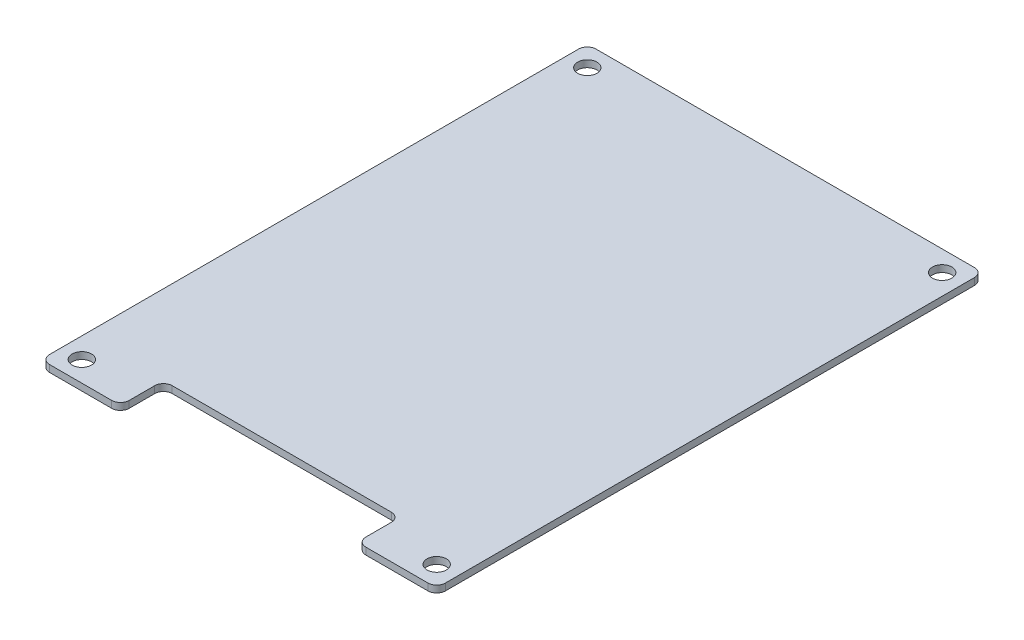
ISO-10303-21;
HEADER;
FILE_DESCRIPTION(('STEP AP214'),'2;1');
FILE_NAME('part.step','',(''),(''),'','','');
FILE_SCHEMA(('AUTOMOTIVE_DESIGN { 1 0 10303 214 1 1 1 1 }'));
ENDSEC;
DATA;
#1=APPLICATION_CONTEXT('core data for automotive mechanical design processes');
#2=APPLICATION_PROTOCOL_DEFINITION('international standard','automotive_design',2000,#1);
#3=PRODUCT_CONTEXT('',#1,'mechanical');
#4=PRODUCT('Part','Part','',(#3));
#5=PRODUCT_RELATED_PRODUCT_CATEGORY('part','',(#4));
#6=PRODUCT_DEFINITION_FORMATION('','',#4);
#7=PRODUCT_DEFINITION_CONTEXT('part definition',#1,'design');
#8=PRODUCT_DEFINITION('design','',#6,#7);
#9=PRODUCT_DEFINITION_SHAPE('','',#8);
#10=(LENGTH_UNIT() NAMED_UNIT(*) SI_UNIT(.MILLI.,.METRE.));
#11=(NAMED_UNIT(*) PLANE_ANGLE_UNIT() SI_UNIT($,.RADIAN.));
#12=(NAMED_UNIT(*) SI_UNIT($,.STERADIAN.) SOLID_ANGLE_UNIT());
#13=UNCERTAINTY_MEASURE_WITH_UNIT(LENGTH_MEASURE(1.E-05),#10,'distance_accuracy_value','');
#14=(GEOMETRIC_REPRESENTATION_CONTEXT(3) GLOBAL_UNCERTAINTY_ASSIGNED_CONTEXT((#13)) GLOBAL_UNIT_ASSIGNED_CONTEXT((#10,
#11,#12)) REPRESENTATION_CONTEXT('',''));
#15=CARTESIAN_POINT('',(0.,0.,0.));
#16=DIRECTION('',(0.,0.,1.));
#17=DIRECTION('',(1.,0.,0.));
#18=AXIS2_PLACEMENT_3D('',#15,#16,#17);
#19=CARTESIAN_POINT('',(-46.,1.6,63.5));
#20=DIRECTION('',(0.,0.,-1.));
#21=DIRECTION('',(-1.,0.,0.));
#22=AXIS2_PLACEMENT_3D('',#19,#20,#21);
#23=PLANE('',#22);
#24=DIRECTION('',(1.,0.,0.));
#25=VECTOR('',#24,1.);
#26=CARTESIAN_POINT('',(-46.,0.,63.5));
#27=LINE('',#26,#25);
#28=CARTESIAN_POINT('',(29.532,0.,63.5));
#29=VERTEX_POINT('',#28);
#30=CARTESIAN_POINT('',(43.968,0.,63.5));
#31=VERTEX_POINT('',#30);
#32=EDGE_CURVE('E180',#29,#31,#27,.T.);
#33=ORIENTED_EDGE('',*,*,#32,.T.);
#34=DIRECTION('',(0.,-1.,0.));
#35=VECTOR('',#34,1.);
#36=CARTESIAN_POINT('',(43.968,1.6,63.5));
#37=LINE('',#36,#35);
#38=CARTESIAN_POINT('',(43.968,1.6,63.5));
#39=VERTEX_POINT('',#38);
#40=EDGE_CURVE('E229',#31,#39,#37,.F.);
#41=ORIENTED_EDGE('',*,*,#40,.T.);
#42=DIRECTION('',(1.,0.,0.));
#43=VECTOR('',#42,1.);
#44=CARTESIAN_POINT('',(-46.,1.6,63.5));
#45=LINE('',#44,#43);
#46=CARTESIAN_POINT('',(29.532,1.6,63.5));
#47=VERTEX_POINT('',#46);
#48=EDGE_CURVE('E305',#47,#39,#45,.T.);
#49=ORIENTED_EDGE('',*,*,#48,.F.);
#50=DIRECTION('',(0.,1.,0.));
#51=VECTOR('',#50,1.);
#52=CARTESIAN_POINT('',(29.532,1.6,63.5));
#53=LINE('',#52,#51);
#54=EDGE_CURVE('E227',#47,#29,#53,.F.);
#55=ORIENTED_EDGE('',*,*,#54,.T.);
#56=EDGE_LOOP('',(#33,#41,#49,#55));
#57=FACE_BOUND('',#56,.T.);
#58=ADVANCED_FACE('F39',(#57),#23,.F.);
#59=CARTESIAN_POINT('',(46.,1.6,63.5));
#60=DIRECTION('',(-1.,0.,0.));
#61=DIRECTION('',(0.,0.,1.));
#62=AXIS2_PLACEMENT_3D('',#59,#60,#61);
#63=PLANE('',#62);
#64=DIRECTION('',(0.,0.,-1.));
#65=VECTOR('',#64,1.);
#66=CARTESIAN_POINT('',(46.,0.,63.5));
#67=LINE('',#66,#65);
#68=CARTESIAN_POINT('',(46.,0.,61.468));
#69=VERTEX_POINT('',#68);
#70=CARTESIAN_POINT('',(46.,0.,-61.468));
#71=VERTEX_POINT('',#70);
#72=EDGE_CURVE('E186',#69,#71,#67,.T.);
#73=ORIENTED_EDGE('',*,*,#72,.T.);
#74=DIRECTION('',(0.,-1.,0.));
#75=VECTOR('',#74,1.);
#76=CARTESIAN_POINT('',(46.,1.6,-61.468));
#77=LINE('',#76,#75);
#78=CARTESIAN_POINT('',(46.,1.6,-61.468));
#79=VERTEX_POINT('',#78);
#80=EDGE_CURVE('E225',#71,#79,#77,.F.);
#81=ORIENTED_EDGE('',*,*,#80,.T.);
#82=DIRECTION('',(0.,0.,-1.));
#83=VECTOR('',#82,1.);
#84=CARTESIAN_POINT('',(46.,1.6,63.5));
#85=LINE('',#84,#83);
#86=CARTESIAN_POINT('',(46.,1.6,61.468));
#87=VERTEX_POINT('',#86);
#88=EDGE_CURVE('E299',#87,#79,#85,.T.);
#89=ORIENTED_EDGE('',*,*,#88,.F.);
#90=DIRECTION('',(0.,-1.,0.));
#91=VECTOR('',#90,1.);
#92=CARTESIAN_POINT('',(46.,1.6,61.468));
#93=LINE('',#92,#91);
#94=EDGE_CURVE('E222',#87,#69,#93,.T.);
#95=ORIENTED_EDGE('',*,*,#94,.T.);
#96=EDGE_LOOP('',(#73,#81,#89,#95));
#97=FACE_BOUND('',#96,.T.);
#98=ADVANCED_FACE('F310',(#97),#63,.F.);
#99=CARTESIAN_POINT('',(-46.,1.6,-63.5));
#100=DIRECTION('',(0.,0.,1.));
#101=DIRECTION('',(1.,0.,0.));
#102=AXIS2_PLACEMENT_3D('',#99,#100,#101);
#103=PLANE('',#102);
#104=DIRECTION('',(-1.,0.,0.));
#105=VECTOR('',#104,1.);
#106=CARTESIAN_POINT('',(-46.,0.,-63.5));
#107=LINE('',#106,#105);
#108=CARTESIAN_POINT('',(43.968,0.,-63.5));
#109=VERTEX_POINT('',#108);
#110=CARTESIAN_POINT('',(-43.968,0.,-63.5));
#111=VERTEX_POINT('',#110);
#112=EDGE_CURVE('E181',#109,#111,#107,.T.);
#113=ORIENTED_EDGE('',*,*,#112,.T.);
#114=DIRECTION('',(0.,-1.,0.));
#115=VECTOR('',#114,1.);
#116=CARTESIAN_POINT('',(-43.968,1.6,-63.5));
#117=LINE('',#116,#115);
#118=CARTESIAN_POINT('',(-43.968,1.6,-63.5));
#119=VERTEX_POINT('',#118);
#120=EDGE_CURVE('E157',#111,#119,#117,.F.);
#121=ORIENTED_EDGE('',*,*,#120,.T.);
#122=DIRECTION('',(-1.,0.,0.));
#123=VECTOR('',#122,1.);
#124=CARTESIAN_POINT('',(-46.,1.6,-63.5));
#125=LINE('',#124,#123);
#126=CARTESIAN_POINT('',(43.968,1.6,-63.5));
#127=VERTEX_POINT('',#126);
#128=EDGE_CURVE('E302',#127,#119,#125,.T.);
#129=ORIENTED_EDGE('',*,*,#128,.F.);
#130=DIRECTION('',(0.,-1.,0.));
#131=VECTOR('',#130,1.);
#132=CARTESIAN_POINT('',(43.968,1.6,-63.5));
#133=LINE('',#132,#131);
#134=EDGE_CURVE('E162',#127,#109,#133,.T.);
#135=ORIENTED_EDGE('',*,*,#134,.T.);
#136=EDGE_LOOP('',(#113,#121,#129,#135));
#137=FACE_BOUND('',#136,.T.);
#138=ADVANCED_FACE('F319',(#137),#103,.F.);
#139=CARTESIAN_POINT('',(-46.,1.6,63.5));
#140=DIRECTION('',(1.,0.,0.));
#141=DIRECTION('',(0.,0.,-1.));
#142=AXIS2_PLACEMENT_3D('',#139,#140,#141);
#143=PLANE('',#142);
#144=DIRECTION('',(0.,0.,1.));
#145=VECTOR('',#144,1.);
#146=CARTESIAN_POINT('',(-46.,1.6,63.5));
#147=LINE('',#146,#145);
#148=CARTESIAN_POINT('',(-46.,1.6,-61.468));
#149=VERTEX_POINT('',#148);
#150=CARTESIAN_POINT('',(-46.,1.6,61.468));
#151=VERTEX_POINT('',#150);
#152=EDGE_CURVE('E172',#149,#151,#147,.T.);
#153=ORIENTED_EDGE('',*,*,#152,.F.);
#154=DIRECTION('',(0.,-1.,0.));
#155=VECTOR('',#154,1.);
#156=CARTESIAN_POINT('',(-46.,1.6,-61.468));
#157=LINE('',#156,#155);
#158=CARTESIAN_POINT('',(-46.,0.,-61.468));
#159=VERTEX_POINT('',#158);
#160=EDGE_CURVE('E156',#149,#159,#157,.T.);
#161=ORIENTED_EDGE('',*,*,#160,.T.);
#162=DIRECTION('',(0.,0.,1.));
#163=VECTOR('',#162,1.);
#164=CARTESIAN_POINT('',(-46.,0.,63.5));
#165=LINE('',#164,#163);
#166=CARTESIAN_POINT('',(-46.,0.,61.468));
#167=VERTEX_POINT('',#166);
#168=EDGE_CURVE('E169',#159,#167,#165,.T.);
#169=ORIENTED_EDGE('',*,*,#168,.T.);
#170=DIRECTION('',(0.,-1.,0.));
#171=VECTOR('',#170,1.);
#172=CARTESIAN_POINT('',(-46.,1.6,61.468));
#173=LINE('',#172,#171);
#174=EDGE_CURVE('E174',#167,#151,#173,.F.);
#175=ORIENTED_EDGE('',*,*,#174,.T.);
#176=EDGE_LOOP('',(#153,#161,#169,#175));
#177=FACE_BOUND('',#176,.T.);
#178=ADVANCED_FACE('F168',(#177),#143,.F.);
#179=CARTESIAN_POINT('',(-43.968,1.6,63.5));
#180=VERTEX_POINT('',#179);
#181=CARTESIAN_POINT('',(-29.532,1.6,63.5));
#182=VERTEX_POINT('',#181);
#183=EDGE_CURVE('E199',#180,#182,#45,.T.);
#184=ORIENTED_EDGE('',*,*,#183,.F.);
#185=DIRECTION('',(0.,-1.,0.));
#186=VECTOR('',#185,1.);
#187=CARTESIAN_POINT('',(-43.968,1.6,63.5));
#188=LINE('',#187,#186);
#189=CARTESIAN_POINT('',(-43.968,0.,63.5));
#190=VERTEX_POINT('',#189);
#191=EDGE_CURVE('E244',#180,#190,#188,.T.);
#192=ORIENTED_EDGE('',*,*,#191,.T.);
#193=CARTESIAN_POINT('',(-29.532,0.,63.5));
#194=VERTEX_POINT('',#193);
#195=EDGE_CURVE('E184',#190,#194,#27,.T.);
#196=ORIENTED_EDGE('',*,*,#195,.T.);
#197=DIRECTION('',(0.,1.,0.));
#198=VECTOR('',#197,1.);
#199=CARTESIAN_POINT('',(-29.532,1.6,63.5));
#200=LINE('',#199,#198);
#201=EDGE_CURVE('E241',#194,#182,#200,.T.);
#202=ORIENTED_EDGE('',*,*,#201,.T.);
#203=EDGE_LOOP('',(#184,#192,#196,#202));
#204=FACE_BOUND('',#203,.T.);
#205=ADVANCED_FACE('F326',(#204),#23,.F.);
#206=CARTESIAN_POINT('',(0.,1.6,0.));
#207=DIRECTION('',(0.,-1.,0.));
#208=DIRECTION('',(0.,0.,-1.));
#209=AXIS2_PLACEMENT_3D('',#206,#207,#208);
#210=PLANE('',#209);
#211=CARTESIAN_POINT('',(-41.2375,1.6,-58.7375));
#212=DIRECTION('',(0.,1.,0.));
#213=DIRECTION('',(0.,0.,1.));
#214=AXIS2_PLACEMENT_3D('',#211,#212,#213);
#215=CIRCLE('',#214,2.25);
#216=CARTESIAN_POINT('',(-41.2375,1.6,-56.4875));
#217=VERTEX_POINT('',#216);
#218=EDGE_CURVE('E276',#217,#217,#215,.T.);
#219=ORIENTED_EDGE('',*,*,#218,.F.);
#220=EDGE_LOOP('',(#219));
#221=FACE_BOUND('',#220,.T.);
#222=CARTESIAN_POINT('',(41.2375,1.6,-58.7375));
#223=DIRECTION('',(0.,1.,0.));
#224=DIRECTION('',(0.,0.,1.));
#225=AXIS2_PLACEMENT_3D('',#222,#223,#224);
#226=CIRCLE('',#225,2.25);
#227=CARTESIAN_POINT('',(41.2375,1.6,-56.4875));
#228=VERTEX_POINT('',#227);
#229=EDGE_CURVE('E198',#228,#228,#226,.T.);
#230=ORIENTED_EDGE('',*,*,#229,.F.);
#231=EDGE_LOOP('',(#230));
#232=FACE_BOUND('',#231,.T.);
#233=CARTESIAN_POINT('',(41.2375,1.6,58.7375));
#234=DIRECTION('',(0.,1.,0.));
#235=DIRECTION('',(0.,0.,1.));
#236=AXIS2_PLACEMENT_3D('',#233,#234,#235);
#237=CIRCLE('',#236,2.25);
#238=CARTESIAN_POINT('',(41.2375,1.6,60.9875));
#239=VERTEX_POINT('',#238);
#240=EDGE_CURVE('E194',#239,#239,#237,.T.);
#241=ORIENTED_EDGE('',*,*,#240,.F.);
#242=EDGE_LOOP('',(#241));
#243=FACE_BOUND('',#242,.T.);
#244=CARTESIAN_POINT('',(-41.2375,1.6,58.7375));
#245=DIRECTION('',(0.,1.,0.));
#246=DIRECTION('',(0.,0.,1.));
#247=AXIS2_PLACEMENT_3D('',#244,#245,#246);
#248=CIRCLE('',#247,2.25);
#249=CARTESIAN_POINT('',(-41.2375,1.6,60.9875));
#250=VERTEX_POINT('',#249);
#251=EDGE_CURVE('E193',#250,#250,#248,.T.);
#252=ORIENTED_EDGE('',*,*,#251,.F.);
#253=EDGE_LOOP('',(#252));
#254=FACE_BOUND('',#253,.T.);
#255=ORIENTED_EDGE('',*,*,#128,.T.);
#256=CARTESIAN_POINT('',(-43.968,1.6,-61.468));
#257=DIRECTION('',(0.,-1.,0.));
#258=DIRECTION('',(0.,0.,-1.));
#259=AXIS2_PLACEMENT_3D('',#256,#257,#258);
#260=CIRCLE('',#259,2.032);
#261=EDGE_CURVE('E220',#119,#149,#260,.F.);
#262=ORIENTED_EDGE('',*,*,#261,.T.);
#263=ORIENTED_EDGE('',*,*,#152,.T.);
#264=CARTESIAN_POINT('',(-43.968,1.6,61.468));
#265=DIRECTION('',(0.,-1.,0.));
#266=DIRECTION('',(0.,0.,-1.));
#267=AXIS2_PLACEMENT_3D('',#264,#265,#266);
#268=CIRCLE('',#267,2.032);
#269=EDGE_CURVE('E212',#151,#180,#268,.F.);
#270=ORIENTED_EDGE('',*,*,#269,.T.);
#271=ORIENTED_EDGE('',*,*,#183,.T.);
#272=CARTESIAN_POINT('',(-29.532,1.6,61.468));
#273=DIRECTION('',(0.,-1.,0.));
#274=DIRECTION('',(0.,0.,-1.));
#275=AXIS2_PLACEMENT_3D('',#272,#273,#274);
#276=CIRCLE('',#275,2.032);
#277=CARTESIAN_POINT('',(-27.5,1.6,61.468));
#278=VERTEX_POINT('',#277);
#279=EDGE_CURVE('E54',#182,#278,#276,.F.);
#280=ORIENTED_EDGE('',*,*,#279,.T.);
#281=DIRECTION('',(0.,0.,1.));
#282=VECTOR('',#281,1.);
#283=CARTESIAN_POINT('',(-27.5,1.6,53.5));
#284=LINE('',#283,#282);
#285=CARTESIAN_POINT('',(-27.5,1.6,55.532));
#286=VERTEX_POINT('',#285);
#287=EDGE_CURVE('E259',#286,#278,#284,.T.);
#288=ORIENTED_EDGE('',*,*,#287,.F.);
#289=CARTESIAN_POINT('',(-25.468,1.6,55.532));
#290=DIRECTION('',(0.,-1.,0.));
#291=DIRECTION('',(0.,0.,-1.));
#292=AXIS2_PLACEMENT_3D('',#289,#290,#291);
#293=CIRCLE('',#292,2.032);
#294=CARTESIAN_POINT('',(-25.468,1.6,53.5));
#295=VERTEX_POINT('',#294);
#296=EDGE_CURVE('E47',#286,#295,#293,.T.);
#297=ORIENTED_EDGE('',*,*,#296,.T.);
#298=DIRECTION('',(-1.,0.,0.));
#299=VECTOR('',#298,1.);
#300=CARTESIAN_POINT('',(-27.5,1.6,53.5));
#301=LINE('',#300,#299);
#302=CARTESIAN_POINT('',(25.468,1.6,53.5));
#303=VERTEX_POINT('',#302);
#304=EDGE_CURVE('E258',#303,#295,#301,.T.);
#305=ORIENTED_EDGE('',*,*,#304,.F.);
#306=CARTESIAN_POINT('',(25.468,1.6,55.532));
#307=DIRECTION('',(0.,-1.,0.));
#308=DIRECTION('',(0.,0.,-1.));
#309=AXIS2_PLACEMENT_3D('',#306,#307,#308);
#310=CIRCLE('',#309,2.032);
#311=CARTESIAN_POINT('',(27.5,1.6,55.532));
#312=VERTEX_POINT('',#311);
#313=EDGE_CURVE('E251',#303,#312,#310,.T.);
#314=ORIENTED_EDGE('',*,*,#313,.T.);
#315=DIRECTION('',(0.,0.,-1.));
#316=VECTOR('',#315,1.);
#317=CARTESIAN_POINT('',(27.5,1.6,53.5));
#318=LINE('',#317,#316);
#319=CARTESIAN_POINT('',(27.5,1.6,61.468));
#320=VERTEX_POINT('',#319);
#321=EDGE_CURVE('E265',#320,#312,#318,.T.);
#322=ORIENTED_EDGE('',*,*,#321,.F.);
#323=CARTESIAN_POINT('',(29.532,1.6,61.468));
#324=DIRECTION('',(0.,-1.,0.));
#325=DIRECTION('',(0.,0.,-1.));
#326=AXIS2_PLACEMENT_3D('',#323,#324,#325);
#327=CIRCLE('',#326,2.032);
#328=EDGE_CURVE('E214',#320,#47,#327,.F.);
#329=ORIENTED_EDGE('',*,*,#328,.T.);
#330=ORIENTED_EDGE('',*,*,#48,.T.);
#331=CARTESIAN_POINT('',(43.968,1.6,61.468));
#332=DIRECTION('',(0.,-1.,0.));
#333=DIRECTION('',(0.,0.,-1.));
#334=AXIS2_PLACEMENT_3D('',#331,#332,#333);
#335=CIRCLE('',#334,2.032);
#336=EDGE_CURVE('E216',#39,#87,#335,.F.);
#337=ORIENTED_EDGE('',*,*,#336,.T.);
#338=ORIENTED_EDGE('',*,*,#88,.T.);
#339=CARTESIAN_POINT('',(43.968,1.6,-61.468));
#340=DIRECTION('',(0.,-1.,0.));
#341=DIRECTION('',(0.,0.,-1.));
#342=AXIS2_PLACEMENT_3D('',#339,#340,#341);
#343=CIRCLE('',#342,2.032);
#344=EDGE_CURVE('E218',#79,#127,#343,.F.);
#345=ORIENTED_EDGE('',*,*,#344,.T.);
#346=EDGE_LOOP('',(#255,#262,#263,#270,#271,#280,#288,#297,#305,#314,#322,#329,#330,#337,#338,#345));
#347=FACE_BOUND('',#346,.T.);
#348=ADVANCED_FACE('F257',(#221,#232,#243,#254,#347),#210,.F.);
#349=CARTESIAN_POINT('',(0.,0.,0.));
#350=DIRECTION('',(0.,-1.,0.));
#351=DIRECTION('',(0.,0.,-1.));
#352=AXIS2_PLACEMENT_3D('',#349,#350,#351);
#353=PLANE('',#352);
#354=ORIENTED_EDGE('',*,*,#168,.F.);
#355=CARTESIAN_POINT('',(-43.968,0.,-61.468));
#356=DIRECTION('',(0.,-1.,0.));
#357=DIRECTION('',(0.,0.,-1.));
#358=AXIS2_PLACEMENT_3D('',#355,#356,#357);
#359=CIRCLE('',#358,2.032);
#360=EDGE_CURVE('E152',#159,#111,#359,.T.);
#361=ORIENTED_EDGE('',*,*,#360,.T.);
#362=ORIENTED_EDGE('',*,*,#112,.F.);
#363=CARTESIAN_POINT('',(43.968,0.,-61.468));
#364=DIRECTION('',(0.,-1.,0.));
#365=DIRECTION('',(0.,0.,-1.));
#366=AXIS2_PLACEMENT_3D('',#363,#364,#365);
#367=CIRCLE('',#366,2.032);
#368=EDGE_CURVE('E163',#109,#71,#367,.T.);
#369=ORIENTED_EDGE('',*,*,#368,.T.);
#370=ORIENTED_EDGE('',*,*,#72,.F.);
#371=CARTESIAN_POINT('',(43.968,0.,61.468));
#372=DIRECTION('',(0.,-1.,0.));
#373=DIRECTION('',(0.,0.,-1.));
#374=AXIS2_PLACEMENT_3D('',#371,#372,#373);
#375=CIRCLE('',#374,2.032);
#376=EDGE_CURVE('E205',#69,#31,#375,.T.);
#377=ORIENTED_EDGE('',*,*,#376,.T.);
#378=ORIENTED_EDGE('',*,*,#32,.F.);
#379=CARTESIAN_POINT('',(29.532,0.,61.468));
#380=DIRECTION('',(0.,-1.,0.));
#381=DIRECTION('',(0.,0.,-1.));
#382=AXIS2_PLACEMENT_3D('',#379,#380,#381);
#383=CIRCLE('',#382,2.032);
#384=CARTESIAN_POINT('',(27.5,0.,61.468));
#385=VERTEX_POINT('',#384);
#386=EDGE_CURVE('E203',#29,#385,#383,.T.);
#387=ORIENTED_EDGE('',*,*,#386,.T.);
#388=DIRECTION('',(0.,0.,-1.));
#389=VECTOR('',#388,1.);
#390=CARTESIAN_POINT('',(27.5,0.,53.5));
#391=LINE('',#390,#389);
#392=CARTESIAN_POINT('',(27.5,0.,55.532));
#393=VERTEX_POINT('',#392);
#394=EDGE_CURVE('E281',#385,#393,#391,.T.);
#395=ORIENTED_EDGE('',*,*,#394,.T.);
#396=CARTESIAN_POINT('',(25.468,0.,55.532));
#397=DIRECTION('',(0.,-1.,0.));
#398=DIRECTION('',(0.,0.,-1.));
#399=AXIS2_PLACEMENT_3D('',#396,#397,#398);
#400=CIRCLE('',#399,2.032);
#401=CARTESIAN_POINT('',(25.468,0.,53.5));
#402=VERTEX_POINT('',#401);
#403=EDGE_CURVE('E253',#393,#402,#400,.F.);
#404=ORIENTED_EDGE('',*,*,#403,.T.);
#405=DIRECTION('',(-1.,0.,0.));
#406=VECTOR('',#405,1.);
#407=CARTESIAN_POINT('',(-27.5,0.,53.5));
#408=LINE('',#407,#406);
#409=CARTESIAN_POINT('',(-25.468,0.,53.5));
#410=VERTEX_POINT('',#409);
#411=EDGE_CURVE('E272',#402,#410,#408,.T.);
#412=ORIENTED_EDGE('',*,*,#411,.T.);
#413=CARTESIAN_POINT('',(-25.468,0.,55.532));
#414=DIRECTION('',(0.,-1.,0.));
#415=DIRECTION('',(0.,0.,-1.));
#416=AXIS2_PLACEMENT_3D('',#413,#414,#415);
#417=CIRCLE('',#416,2.032);
#418=CARTESIAN_POINT('',(-27.5,0.,55.532));
#419=VERTEX_POINT('',#418);
#420=EDGE_CURVE('E11',#410,#419,#417,.F.);
#421=ORIENTED_EDGE('',*,*,#420,.T.);
#422=DIRECTION('',(0.,0.,1.));
#423=VECTOR('',#422,1.);
#424=CARTESIAN_POINT('',(-27.5,0.,53.5));
#425=LINE('',#424,#423);
#426=CARTESIAN_POINT('',(-27.5,0.,61.468));
#427=VERTEX_POINT('',#426);
#428=EDGE_CURVE('E270',#419,#427,#425,.T.);
#429=ORIENTED_EDGE('',*,*,#428,.T.);
#430=CARTESIAN_POINT('',(-29.532,0.,61.468));
#431=DIRECTION('',(0.,-1.,0.));
#432=DIRECTION('',(0.,0.,-1.));
#433=AXIS2_PLACEMENT_3D('',#430,#431,#432);
#434=CIRCLE('',#433,2.032);
#435=EDGE_CURVE('E173',#427,#194,#434,.T.);
#436=ORIENTED_EDGE('',*,*,#435,.T.);
#437=ORIENTED_EDGE('',*,*,#195,.F.);
#438=CARTESIAN_POINT('',(-43.968,0.,61.468));
#439=DIRECTION('',(0.,-1.,0.));
#440=DIRECTION('',(0.,0.,-1.));
#441=AXIS2_PLACEMENT_3D('',#438,#439,#440);
#442=CIRCLE('',#441,2.032);
#443=EDGE_CURVE('E179',#190,#167,#442,.T.);
#444=ORIENTED_EDGE('',*,*,#443,.T.);
#445=EDGE_LOOP('',(#354,#361,#362,#369,#370,#377,#378,#387,#395,#404,#412,#421,#429,#436,#437,#444));
#446=FACE_BOUND('',#445,.T.);
#447=CARTESIAN_POINT('',(-41.2375,0.,-58.7375));
#448=DIRECTION('',(0.,-1.,0.));
#449=DIRECTION('',(0.,0.,-1.));
#450=AXIS2_PLACEMENT_3D('',#447,#448,#449);
#451=CIRCLE('',#450,2.24999999999999);
#452=CARTESIAN_POINT('',(-41.2375,0.,-60.9874999999999));
#453=VERTEX_POINT('',#452);
#454=EDGE_CURVE('E279',#453,#453,#451,.T.);
#455=ORIENTED_EDGE('',*,*,#454,.F.);
#456=EDGE_LOOP('',(#455));
#457=FACE_BOUND('',#456,.T.);
#458=CARTESIAN_POINT('',(41.2375,0.,-58.7375));
#459=DIRECTION('',(0.,-1.,0.));
#460=DIRECTION('',(0.,0.,-1.));
#461=AXIS2_PLACEMENT_3D('',#458,#459,#460);
#462=CIRCLE('',#461,2.24999999999999);
#463=CARTESIAN_POINT('',(41.2375,0.,-60.9874999999999));
#464=VERTEX_POINT('',#463);
#465=EDGE_CURVE('E195',#464,#464,#462,.T.);
#466=ORIENTED_EDGE('',*,*,#465,.F.);
#467=EDGE_LOOP('',(#466));
#468=FACE_BOUND('',#467,.T.);
#469=CARTESIAN_POINT('',(41.2375,0.,58.7375));
#470=DIRECTION('',(0.,-1.,0.));
#471=DIRECTION('',(0.,0.,-1.));
#472=AXIS2_PLACEMENT_3D('',#469,#470,#471);
#473=CIRCLE('',#472,2.24999999999999);
#474=CARTESIAN_POINT('',(41.2375,0.,56.4875));
#475=VERTEX_POINT('',#474);
#476=EDGE_CURVE('E190',#475,#475,#473,.T.);
#477=ORIENTED_EDGE('',*,*,#476,.F.);
#478=EDGE_LOOP('',(#477));
#479=FACE_BOUND('',#478,.T.);
#480=CARTESIAN_POINT('',(-41.2375,0.,58.7375));
#481=DIRECTION('',(0.,-1.,0.));
#482=DIRECTION('',(0.,0.,-1.));
#483=AXIS2_PLACEMENT_3D('',#480,#481,#482);
#484=CIRCLE('',#483,2.24999999999999);
#485=CARTESIAN_POINT('',(-41.2375,0.,56.4875));
#486=VERTEX_POINT('',#485);
#487=EDGE_CURVE('E296',#486,#486,#484,.T.);
#488=ORIENTED_EDGE('',*,*,#487,.F.);
#489=EDGE_LOOP('',(#488));
#490=FACE_BOUND('',#489,.T.);
#491=ADVANCED_FACE('F176',(#446,#457,#468,#479,#490),#353,.T.);
#492=CARTESIAN_POINT('',(-41.2375,1.6,58.7375));
#493=DIRECTION('',(0.,1.,0.));
#494=DIRECTION('',(0.,0.,1.));
#495=AXIS2_PLACEMENT_3D('',#492,#493,#494);
#496=CYLINDRICAL_SURFACE('',#495,2.24999999999999);
#497=ORIENTED_EDGE('',*,*,#487,.T.);
#498=EDGE_LOOP('',(#497));
#499=FACE_BOUND('',#498,.T.);
#500=ORIENTED_EDGE('',*,*,#251,.T.);
#501=EDGE_LOOP('',(#500));
#502=FACE_BOUND('',#501,.T.);
#503=ADVANCED_FACE('F396',(#499,#502),#496,.F.);
#504=CARTESIAN_POINT('',(41.2375,1.6,58.7375));
#505=DIRECTION('',(0.,1.,0.));
#506=DIRECTION('',(0.,0.,1.));
#507=AXIS2_PLACEMENT_3D('',#504,#505,#506);
#508=CYLINDRICAL_SURFACE('',#507,2.24999999999999);
#509=ORIENTED_EDGE('',*,*,#476,.T.);
#510=EDGE_LOOP('',(#509));
#511=FACE_BOUND('',#510,.T.);
#512=ORIENTED_EDGE('',*,*,#240,.T.);
#513=EDGE_LOOP('',(#512));
#514=FACE_BOUND('',#513,.T.);
#515=ADVANCED_FACE('F392',(#511,#514),#508,.F.);
#516=CARTESIAN_POINT('',(41.2375,1.6,-58.7375));
#517=DIRECTION('',(0.,1.,0.));
#518=DIRECTION('',(0.,0.,1.));
#519=AXIS2_PLACEMENT_3D('',#516,#517,#518);
#520=CYLINDRICAL_SURFACE('',#519,2.24999999999999);
#521=ORIENTED_EDGE('',*,*,#465,.T.);
#522=EDGE_LOOP('',(#521));
#523=FACE_BOUND('',#522,.T.);
#524=ORIENTED_EDGE('',*,*,#229,.T.);
#525=EDGE_LOOP('',(#524));
#526=FACE_BOUND('',#525,.T.);
#527=ADVANCED_FACE('F388',(#523,#526),#520,.F.);
#528=CARTESIAN_POINT('',(-41.2375,1.6,-58.7375));
#529=DIRECTION('',(0.,1.,0.));
#530=DIRECTION('',(0.,0.,1.));
#531=AXIS2_PLACEMENT_3D('',#528,#529,#530);
#532=CYLINDRICAL_SURFACE('',#531,2.24999999999999);
#533=ORIENTED_EDGE('',*,*,#454,.T.);
#534=EDGE_LOOP('',(#533));
#535=FACE_BOUND('',#534,.T.);
#536=ORIENTED_EDGE('',*,*,#218,.T.);
#537=EDGE_LOOP('',(#536));
#538=FACE_BOUND('',#537,.T.);
#539=ADVANCED_FACE('F384',(#535,#538),#532,.F.);
#540=CARTESIAN_POINT('',(27.5,0.,53.5));
#541=DIRECTION('',(1.,0.,0.));
#542=DIRECTION('',(0.,0.,-1.));
#543=AXIS2_PLACEMENT_3D('',#540,#541,#542);
#544=PLANE('',#543);
#545=ORIENTED_EDGE('',*,*,#394,.F.);
#546=DIRECTION('',(0.,1.,0.));
#547=VECTOR('',#546,1.);
#548=CARTESIAN_POINT('',(27.5,0.,61.468));
#549=LINE('',#548,#547);
#550=EDGE_CURVE('E233',#385,#320,#549,.T.);
#551=ORIENTED_EDGE('',*,*,#550,.T.);
#552=ORIENTED_EDGE('',*,*,#321,.T.);
#553=DIRECTION('',(0.,1.,0.));
#554=VECTOR('',#553,1.);
#555=CARTESIAN_POINT('',(27.5,0.,55.532));
#556=LINE('',#555,#554);
#557=EDGE_CURVE('E231',#312,#393,#556,.F.);
#558=ORIENTED_EDGE('',*,*,#557,.T.);
#559=EDGE_LOOP('',(#545,#551,#552,#558));
#560=FACE_BOUND('',#559,.T.);
#561=ADVANCED_FACE('F379',(#560),#544,.F.);
#562=CARTESIAN_POINT('',(-27.5,0.,53.5));
#563=DIRECTION('',(-1.,0.,0.));
#564=DIRECTION('',(0.,0.,1.));
#565=AXIS2_PLACEMENT_3D('',#562,#563,#564);
#566=PLANE('',#565);
#567=ORIENTED_EDGE('',*,*,#287,.T.);
#568=DIRECTION('',(0.,1.,0.));
#569=VECTOR('',#568,1.);
#570=CARTESIAN_POINT('',(-27.5,0.,61.468));
#571=LINE('',#570,#569);
#572=EDGE_CURVE('E249',#278,#427,#571,.F.);
#573=ORIENTED_EDGE('',*,*,#572,.T.);
#574=ORIENTED_EDGE('',*,*,#428,.F.);
#575=DIRECTION('',(0.,1.,0.));
#576=VECTOR('',#575,1.);
#577=CARTESIAN_POINT('',(-27.5,1.6,55.532));
#578=LINE('',#577,#576);
#579=EDGE_CURVE('E247',#419,#286,#578,.T.);
#580=ORIENTED_EDGE('',*,*,#579,.T.);
#581=EDGE_LOOP('',(#567,#573,#574,#580));
#582=FACE_BOUND('',#581,.T.);
#583=ADVANCED_FACE('F274',(#582),#566,.F.);
#584=CARTESIAN_POINT('',(-27.5,0.,53.5));
#585=DIRECTION('',(0.,0.,-1.));
#586=DIRECTION('',(-1.,0.,0.));
#587=AXIS2_PLACEMENT_3D('',#584,#585,#586);
#588=PLANE('',#587);
#589=ORIENTED_EDGE('',*,*,#411,.F.);
#590=DIRECTION('',(0.,1.,0.));
#591=VECTOR('',#590,1.);
#592=CARTESIAN_POINT('',(25.468,1.6,53.5));
#593=LINE('',#592,#591);
#594=EDGE_CURVE('E238',#402,#303,#593,.T.);
#595=ORIENTED_EDGE('',*,*,#594,.T.);
#596=ORIENTED_EDGE('',*,*,#304,.T.);
#597=DIRECTION('',(0.,1.,0.));
#598=VECTOR('',#597,1.);
#599=CARTESIAN_POINT('',(-25.468,0.,53.5));
#600=LINE('',#599,#598);
#601=EDGE_CURVE('E236',#295,#410,#600,.F.);
#602=ORIENTED_EDGE('',*,*,#601,.T.);
#603=EDGE_LOOP('',(#589,#595,#596,#602));
#604=FACE_BOUND('',#603,.T.);
#605=ADVANCED_FACE('F262',(#604),#588,.F.);
#606=CARTESIAN_POINT('',(-43.968,1.6,-61.468));
#607=DIRECTION('',(0.,-1.,0.));
#608=DIRECTION('',(0.,0.,-1.));
#609=AXIS2_PLACEMENT_3D('',#606,#607,#608);
#610=CYLINDRICAL_SURFACE('',#609,2.032);
#611=ORIENTED_EDGE('',*,*,#261,.F.);
#612=ORIENTED_EDGE('',*,*,#120,.F.);
#613=ORIENTED_EDGE('',*,*,#360,.F.);
#614=ORIENTED_EDGE('',*,*,#160,.F.);
#615=EDGE_LOOP('',(#611,#612,#613,#614));
#616=FACE_BOUND('',#615,.T.);
#617=ADVANCED_FACE('F155',(#616),#610,.T.);
#618=CARTESIAN_POINT('',(43.968,1.6,-61.468));
#619=DIRECTION('',(0.,-1.,0.));
#620=DIRECTION('',(0.,0.,-1.));
#621=AXIS2_PLACEMENT_3D('',#618,#619,#620);
#622=CYLINDRICAL_SURFACE('',#621,2.032);
#623=ORIENTED_EDGE('',*,*,#344,.F.);
#624=ORIENTED_EDGE('',*,*,#80,.F.);
#625=ORIENTED_EDGE('',*,*,#368,.F.);
#626=ORIENTED_EDGE('',*,*,#134,.F.);
#627=EDGE_LOOP('',(#623,#624,#625,#626));
#628=FACE_BOUND('',#627,.T.);
#629=ADVANCED_FACE('F315',(#628),#622,.T.);
#630=CARTESIAN_POINT('',(43.968,1.6,61.468));
#631=DIRECTION('',(0.,-1.,0.));
#632=DIRECTION('',(0.,0.,-1.));
#633=AXIS2_PLACEMENT_3D('',#630,#631,#632);
#634=CYLINDRICAL_SURFACE('',#633,2.032);
#635=ORIENTED_EDGE('',*,*,#336,.F.);
#636=ORIENTED_EDGE('',*,*,#40,.F.);
#637=ORIENTED_EDGE('',*,*,#376,.F.);
#638=ORIENTED_EDGE('',*,*,#94,.F.);
#639=EDGE_LOOP('',(#635,#636,#637,#638));
#640=FACE_BOUND('',#639,.T.);
#641=ADVANCED_FACE('F364',(#640),#634,.T.);
#642=CARTESIAN_POINT('',(29.532,0.,61.468));
#643=DIRECTION('',(0.,1.,0.));
#644=DIRECTION('',(0.,0.,1.));
#645=AXIS2_PLACEMENT_3D('',#642,#643,#644);
#646=CYLINDRICAL_SURFACE('',#645,2.032);
#647=ORIENTED_EDGE('',*,*,#386,.F.);
#648=ORIENTED_EDGE('',*,*,#54,.F.);
#649=ORIENTED_EDGE('',*,*,#328,.F.);
#650=ORIENTED_EDGE('',*,*,#550,.F.);
#651=EDGE_LOOP('',(#647,#648,#649,#650));
#652=FACE_BOUND('',#651,.T.);
#653=ADVANCED_FACE('F358',(#652),#646,.T.);
#654=CARTESIAN_POINT('',(25.468,0.,55.532));
#655=DIRECTION('',(0.,-1.,0.));
#656=DIRECTION('',(0.,0.,-1.));
#657=AXIS2_PLACEMENT_3D('',#654,#655,#656);
#658=CYLINDRICAL_SURFACE('',#657,2.032);
#659=ORIENTED_EDGE('',*,*,#403,.F.);
#660=ORIENTED_EDGE('',*,*,#557,.F.);
#661=ORIENTED_EDGE('',*,*,#313,.F.);
#662=ORIENTED_EDGE('',*,*,#594,.F.);
#663=EDGE_LOOP('',(#659,#660,#661,#662));
#664=FACE_BOUND('',#663,.T.);
#665=ADVANCED_FACE('F351',(#664),#658,.F.);
#666=CARTESIAN_POINT('',(-43.968,1.6,61.468));
#667=DIRECTION('',(0.,-1.,0.));
#668=DIRECTION('',(0.,0.,-1.));
#669=AXIS2_PLACEMENT_3D('',#666,#667,#668);
#670=CYLINDRICAL_SURFACE('',#669,2.032);
#671=ORIENTED_EDGE('',*,*,#269,.F.);
#672=ORIENTED_EDGE('',*,*,#174,.F.);
#673=ORIENTED_EDGE('',*,*,#443,.F.);
#674=ORIENTED_EDGE('',*,*,#191,.F.);
#675=EDGE_LOOP('',(#671,#672,#673,#674));
#676=FACE_BOUND('',#675,.T.);
#677=ADVANCED_FACE('F348',(#676),#670,.T.);
#678=CARTESIAN_POINT('',(-29.532,1.6,61.468));
#679=DIRECTION('',(0.,1.,0.));
#680=DIRECTION('',(0.,0.,1.));
#681=AXIS2_PLACEMENT_3D('',#678,#679,#680);
#682=CYLINDRICAL_SURFACE('',#681,2.032);
#683=ORIENTED_EDGE('',*,*,#435,.F.);
#684=ORIENTED_EDGE('',*,*,#572,.F.);
#685=ORIENTED_EDGE('',*,*,#279,.F.);
#686=ORIENTED_EDGE('',*,*,#201,.F.);
#687=EDGE_LOOP('',(#683,#684,#685,#686));
#688=FACE_BOUND('',#687,.T.);
#689=ADVANCED_FACE('F350',(#688),#682,.T.);
#690=CARTESIAN_POINT('',(-25.468,0.,55.532));
#691=DIRECTION('',(0.,-1.,0.));
#692=DIRECTION('',(0.,0.,-1.));
#693=AXIS2_PLACEMENT_3D('',#690,#691,#692);
#694=CYLINDRICAL_SURFACE('',#693,2.032);
#695=ORIENTED_EDGE('',*,*,#420,.F.);
#696=ORIENTED_EDGE('',*,*,#601,.F.);
#697=ORIENTED_EDGE('',*,*,#296,.F.);
#698=ORIENTED_EDGE('',*,*,#579,.F.);
#699=EDGE_LOOP('',(#695,#696,#697,#698));
#700=FACE_BOUND('',#699,.T.);
#701=ADVANCED_FACE('F41',(#700),#694,.F.);
#702=CLOSED_SHELL('',(#58,#98,#138,#178,#205,#348,#491,#503,#515,#527,#539,#561,#583,#605,#617,
#629,#641,#653,#665,#677,#689,#701));
#703=MANIFOLD_SOLID_BREP('B2',#702);
#704=ADVANCED_BREP_SHAPE_REPRESENTATION('',(#18,#703),#14);
#705=SHAPE_DEFINITION_REPRESENTATION(#9,#704);
ENDSEC;
END-ISO-10303-21;
